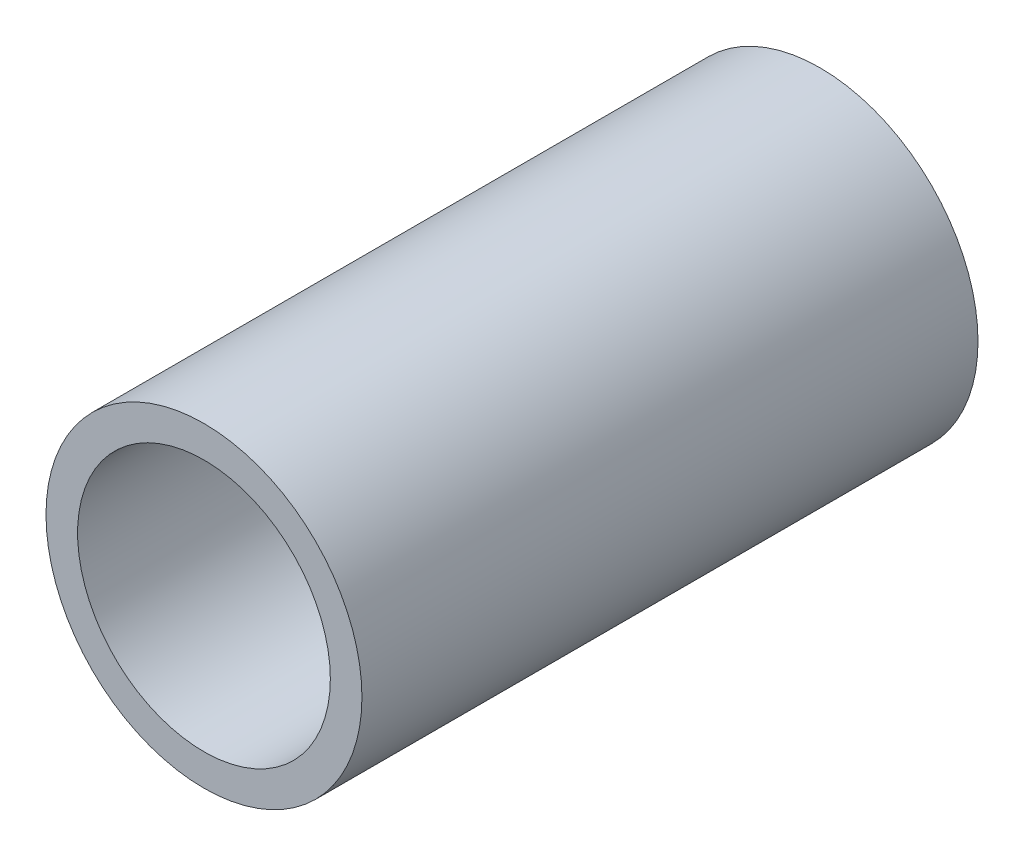
ISO-10303-21;
HEADER;
FILE_DESCRIPTION(('STEP AP214'),'2;1');
FILE_NAME('part.step','',(''),(''),'','','');
FILE_SCHEMA(('AUTOMOTIVE_DESIGN { 1 0 10303 214 1 1 1 1 }'));
ENDSEC;
DATA;
#1=APPLICATION_CONTEXT('core data for automotive mechanical design processes');
#2=APPLICATION_PROTOCOL_DEFINITION('international standard','automotive_design',2000,#1);
#3=PRODUCT_CONTEXT('',#1,'mechanical');
#4=PRODUCT('Part','Part','',(#3));
#5=PRODUCT_RELATED_PRODUCT_CATEGORY('part','',(#4));
#6=PRODUCT_DEFINITION_FORMATION('','',#4);
#7=PRODUCT_DEFINITION_CONTEXT('part definition',#1,'design');
#8=PRODUCT_DEFINITION('design','',#6,#7);
#9=PRODUCT_DEFINITION_SHAPE('','',#8);
#10=(LENGTH_UNIT() NAMED_UNIT(*) SI_UNIT(.MILLI.,.METRE.));
#11=(NAMED_UNIT(*) PLANE_ANGLE_UNIT() SI_UNIT($,.RADIAN.));
#12=(NAMED_UNIT(*) SI_UNIT($,.STERADIAN.) SOLID_ANGLE_UNIT());
#13=UNCERTAINTY_MEASURE_WITH_UNIT(LENGTH_MEASURE(1.E-05),#10,'distance_accuracy_value','');
#14=(GEOMETRIC_REPRESENTATION_CONTEXT(3) GLOBAL_UNCERTAINTY_ASSIGNED_CONTEXT((#13)) GLOBAL_UNIT_ASSIGNED_CONTEXT((#10,
#11,#12)) REPRESENTATION_CONTEXT('',''));
#15=CARTESIAN_POINT('',(0.,0.,0.));
#16=DIRECTION('',(0.,0.,1.));
#17=DIRECTION('',(1.,0.,0.));
#18=AXIS2_PLACEMENT_3D('',#15,#16,#17);
#19=CARTESIAN_POINT('',(0.,0.,0.));
#20=DIRECTION('',(0.,0.,1.));
#21=DIRECTION('',(1.,0.,0.));
#22=AXIS2_PLACEMENT_3D('',#19,#20,#21);
#23=CYLINDRICAL_SURFACE('',#22,1.6);
#24=CARTESIAN_POINT('',(0.,0.,3.9));
#25=DIRECTION('',(0.,0.,1.));
#26=DIRECTION('',(1.,0.,0.));
#27=AXIS2_PLACEMENT_3D('',#24,#25,#26);
#28=CIRCLE('',#27,1.6);
#29=CARTESIAN_POINT('',(1.6,0.,3.9));
#30=VERTEX_POINT('',#29);
#31=EDGE_CURVE('E27',#30,#30,#28,.T.);
#32=ORIENTED_EDGE('',*,*,#31,.T.);
#33=EDGE_LOOP('',(#32));
#34=FACE_BOUND('',#33,.T.);
#35=CARTESIAN_POINT('',(0.,0.,-3.9));
#36=DIRECTION('',(0.,0.,1.));
#37=DIRECTION('',(1.,0.,0.));
#38=AXIS2_PLACEMENT_3D('',#35,#36,#37);
#39=CIRCLE('',#38,1.6);
#40=CARTESIAN_POINT('',(1.6,0.,-3.9));
#41=VERTEX_POINT('',#40);
#42=EDGE_CURVE('E18',#41,#41,#39,.T.);
#43=ORIENTED_EDGE('',*,*,#42,.F.);
#44=EDGE_LOOP('',(#43));
#45=FACE_BOUND('',#44,.T.);
#46=ADVANCED_FACE('F15',(#34,#45),#23,.F.);
#47=CARTESIAN_POINT('',(0.,0.,-3.9));
#48=DIRECTION('',(0.,0.,-1.));
#49=DIRECTION('',(-1.,0.,0.));
#50=AXIS2_PLACEMENT_3D('',#47,#48,#49);
#51=PLANE('',#50);
#52=ORIENTED_EDGE('',*,*,#42,.T.);
#53=EDGE_LOOP('',(#52));
#54=FACE_BOUND('',#53,.T.);
#55=CARTESIAN_POINT('',(0.,0.,-3.9));
#56=DIRECTION('',(0.,0.,1.));
#57=DIRECTION('',(1.,0.,0.));
#58=AXIS2_PLACEMENT_3D('',#55,#56,#57);
#59=CIRCLE('',#58,2.);
#60=CARTESIAN_POINT('',(2.,0.,-3.9));
#61=VERTEX_POINT('',#60);
#62=EDGE_CURVE('E22',#61,#61,#59,.T.);
#63=ORIENTED_EDGE('',*,*,#62,.F.);
#64=EDGE_LOOP('',(#63));
#65=FACE_BOUND('',#64,.T.);
#66=ADVANCED_FACE('F35',(#54,#65),#51,.T.);
#67=CARTESIAN_POINT('',(0.,0.,3.9));
#68=DIRECTION('',(0.,0.,-1.));
#69=DIRECTION('',(-1.,0.,0.));
#70=AXIS2_PLACEMENT_3D('',#67,#68,#69);
#71=PLANE('',#70);
#72=ORIENTED_EDGE('',*,*,#31,.F.);
#73=EDGE_LOOP('',(#72));
#74=FACE_BOUND('',#73,.T.);
#75=CARTESIAN_POINT('',(0.,0.,3.9));
#76=DIRECTION('',(0.,0.,1.));
#77=DIRECTION('',(1.,0.,0.));
#78=AXIS2_PLACEMENT_3D('',#75,#76,#77);
#79=CIRCLE('',#78,2.);
#80=CARTESIAN_POINT('',(2.,0.,3.9));
#81=VERTEX_POINT('',#80);
#82=EDGE_CURVE('E10',#81,#81,#79,.F.);
#83=ORIENTED_EDGE('',*,*,#82,.F.);
#84=EDGE_LOOP('',(#83));
#85=FACE_BOUND('',#84,.T.);
#86=ADVANCED_FACE('F43',(#74,#85),#71,.F.);
#87=CARTESIAN_POINT('',(0.,0.,0.));
#88=DIRECTION('',(0.,0.,1.));
#89=DIRECTION('',(1.,0.,0.));
#90=AXIS2_PLACEMENT_3D('',#87,#88,#89);
#91=CYLINDRICAL_SURFACE('',#90,2.);
#92=ORIENTED_EDGE('',*,*,#82,.T.);
#93=EDGE_LOOP('',(#92));
#94=FACE_BOUND('',#93,.T.);
#95=ORIENTED_EDGE('',*,*,#62,.T.);
#96=EDGE_LOOP('',(#95));
#97=FACE_BOUND('',#96,.T.);
#98=ADVANCED_FACE('F44',(#94,#97),#91,.T.);
#99=CLOSED_SHELL('',(#46,#66,#86,#98));
#100=MANIFOLD_SOLID_BREP('B1',#99);
#101=ADVANCED_BREP_SHAPE_REPRESENTATION('',(#18,#100),#14);
#102=SHAPE_DEFINITION_REPRESENTATION(#9,#101);
ENDSEC;
END-ISO-10303-21;
